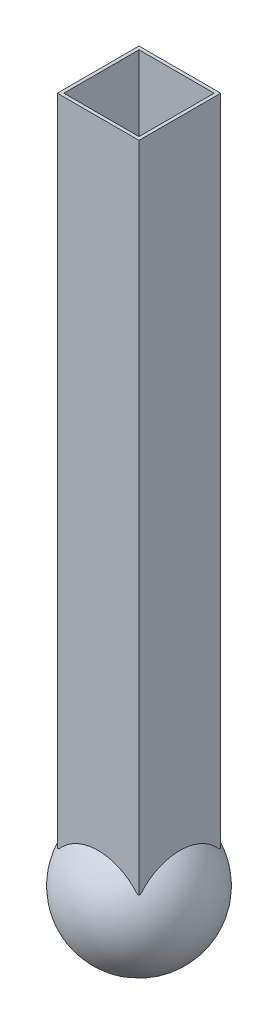
ISO-10303-21;
HEADER;
FILE_DESCRIPTION(('STEP AP214'),'2;1');
FILE_NAME('part.step','',(''),(''),'','','');
FILE_SCHEMA(('AUTOMOTIVE_DESIGN { 1 0 10303 214 1 1 1 1 }'));
ENDSEC;
DATA;
#1=APPLICATION_CONTEXT('core data for automotive mechanical design processes');
#2=APPLICATION_PROTOCOL_DEFINITION('international standard','automotive_design',2000,#1);
#3=PRODUCT_CONTEXT('',#1,'mechanical');
#4=PRODUCT('Part','Part','',(#3));
#5=PRODUCT_RELATED_PRODUCT_CATEGORY('part','',(#4));
#6=PRODUCT_DEFINITION_FORMATION('','',#4);
#7=PRODUCT_DEFINITION_CONTEXT('part definition',#1,'design');
#8=PRODUCT_DEFINITION('design','',#6,#7);
#9=PRODUCT_DEFINITION_SHAPE('','',#8);
#10=(LENGTH_UNIT() NAMED_UNIT(*) SI_UNIT(.MILLI.,.METRE.));
#11=(NAMED_UNIT(*) PLANE_ANGLE_UNIT() SI_UNIT($,.RADIAN.));
#12=(NAMED_UNIT(*) SI_UNIT($,.STERADIAN.) SOLID_ANGLE_UNIT());
#13=UNCERTAINTY_MEASURE_WITH_UNIT(LENGTH_MEASURE(1.E-05),#10,'distance_accuracy_value','');
#14=(GEOMETRIC_REPRESENTATION_CONTEXT(3) GLOBAL_UNCERTAINTY_ASSIGNED_CONTEXT((#13)) GLOBAL_UNIT_ASSIGNED_CONTEXT((#10,
#11,#12)) REPRESENTATION_CONTEXT('',''));
#15=CARTESIAN_POINT('',(0.,0.,0.));
#16=DIRECTION('',(0.,0.,1.));
#17=DIRECTION('',(1.,0.,0.));
#18=AXIS2_PLACEMENT_3D('',#15,#16,#17);
#19=CARTESIAN_POINT('',(0.,0.,0.));
#20=DIRECTION('',(0.,1.,0.));
#21=DIRECTION('',(0.,0.,1.));
#22=AXIS2_PLACEMENT_3D('',#19,#20,#21);
#23=PLANE('',#22);
#24=CARTESIAN_POINT('',(0.,0.,0.));
#25=DIRECTION('',(0.,1.,0.));
#26=DIRECTION('',(0.,0.,1.));
#27=AXIS2_PLACEMENT_3D('',#24,#25,#26);
#28=CIRCLE('',#27,17.3205080756888);
#29=CARTESIAN_POINT('',(-11.9895788082818,0.,12.5));
#30=VERTEX_POINT('',#29);
#31=CARTESIAN_POINT('',(-12.5,0.,11.9895788082818));
#32=VERTEX_POINT('',#31);
#33=EDGE_CURVE('E274',#30,#32,#28,.F.);
#34=ORIENTED_EDGE('',*,*,#33,.F.);
#35=DIRECTION('',(1.,0.,0.));
#36=VECTOR('',#35,1.);
#37=CARTESIAN_POINT('',(-12.5,0.,12.5));
#38=LINE('',#37,#36);
#39=CARTESIAN_POINT('',(-12.5,0.,12.5));
#40=VERTEX_POINT('',#39);
#41=EDGE_CURVE('E213',#40,#30,#38,.T.);
#42=ORIENTED_EDGE('',*,*,#41,.F.);
#43=DIRECTION('',(0.,0.,1.));
#44=VECTOR('',#43,1.);
#45=CARTESIAN_POINT('',(-12.5,0.,-12.5));
#46=LINE('',#45,#44);
#47=EDGE_CURVE('E222',#32,#40,#46,.T.);
#48=ORIENTED_EDGE('',*,*,#47,.F.);
#49=EDGE_LOOP('',(#34,#42,#48));
#50=FACE_BOUND('',#49,.T.);
#51=ADVANCED_FACE('F37',(#50),#23,.F.);
#52=CARTESIAN_POINT('',(-12.5,0.,-11.9895788082818));
#53=VERTEX_POINT('',#52);
#54=CARTESIAN_POINT('',(-11.9895788082818,0.,-12.5));
#55=VERTEX_POINT('',#54);
#56=EDGE_CURVE('E268',#53,#55,#28,.F.);
#57=ORIENTED_EDGE('',*,*,#56,.F.);
#58=CARTESIAN_POINT('',(-12.5,0.,-12.5));
#59=VERTEX_POINT('',#58);
#60=EDGE_CURVE('E218',#59,#53,#46,.T.);
#61=ORIENTED_EDGE('',*,*,#60,.F.);
#62=DIRECTION('',(-1.,0.,0.));
#63=VECTOR('',#62,1.);
#64=CARTESIAN_POINT('',(-12.5,0.,-12.5));
#65=LINE('',#64,#63);
#66=EDGE_CURVE('E226',#55,#59,#65,.T.);
#67=ORIENTED_EDGE('',*,*,#66,.F.);
#68=EDGE_LOOP('',(#57,#61,#67));
#69=FACE_BOUND('',#68,.T.);
#70=ADVANCED_FACE('F384',(#69),#23,.F.);
#71=CARTESIAN_POINT('',(11.9895788082818,0.,-12.5));
#72=VERTEX_POINT('',#71);
#73=CARTESIAN_POINT('',(12.5,0.,-11.9895788082818));
#74=VERTEX_POINT('',#73);
#75=EDGE_CURVE('E270',#72,#74,#28,.F.);
#76=ORIENTED_EDGE('',*,*,#75,.F.);
#77=CARTESIAN_POINT('',(12.5,0.,-12.5));
#78=VERTEX_POINT('',#77);
#79=EDGE_CURVE('E223',#78,#72,#65,.T.);
#80=ORIENTED_EDGE('',*,*,#79,.F.);
#81=DIRECTION('',(0.,0.,-1.));
#82=VECTOR('',#81,1.);
#83=CARTESIAN_POINT('',(12.5,0.,-12.5));
#84=LINE('',#83,#82);
#85=EDGE_CURVE('E230',#74,#78,#84,.T.);
#86=ORIENTED_EDGE('',*,*,#85,.F.);
#87=EDGE_LOOP('',(#76,#80,#86));
#88=FACE_BOUND('',#87,.T.);
#89=ADVANCED_FACE('F389',(#88),#23,.F.);
#90=CARTESIAN_POINT('',(0.,200.,0.));
#91=DIRECTION('',(0.,1.,0.));
#92=DIRECTION('',(0.,0.,1.));
#93=AXIS2_PLACEMENT_3D('',#90,#91,#92);
#94=PLANE('',#93);
#95=DIRECTION('',(0.,0.,-1.));
#96=VECTOR('',#95,1.);
#97=CARTESIAN_POINT('',(12.5,200.,-12.5));
#98=LINE('',#97,#96);
#99=CARTESIAN_POINT('',(12.5,200.,12.5));
#100=VERTEX_POINT('',#99);
#101=CARTESIAN_POINT('',(12.5,200.,-12.5));
#102=VERTEX_POINT('',#101);
#103=EDGE_CURVE('E215',#100,#102,#98,.T.);
#104=ORIENTED_EDGE('',*,*,#103,.T.);
#105=DIRECTION('',(-1.,0.,0.));
#106=VECTOR('',#105,1.);
#107=CARTESIAN_POINT('',(-12.5,200.,-12.5));
#108=LINE('',#107,#106);
#109=CARTESIAN_POINT('',(-12.5,200.,-12.5));
#110=VERTEX_POINT('',#109);
#111=EDGE_CURVE('E234',#102,#110,#108,.T.);
#112=ORIENTED_EDGE('',*,*,#111,.T.);
#113=DIRECTION('',(0.,0.,1.));
#114=VECTOR('',#113,1.);
#115=CARTESIAN_POINT('',(-12.5,200.,-12.5));
#116=LINE('',#115,#114);
#117=CARTESIAN_POINT('',(-12.5,200.,12.5));
#118=VERTEX_POINT('',#117);
#119=EDGE_CURVE('E232',#110,#118,#116,.T.);
#120=ORIENTED_EDGE('',*,*,#119,.T.);
#121=DIRECTION('',(1.,0.,0.));
#122=VECTOR('',#121,1.);
#123=CARTESIAN_POINT('',(-12.5,200.,12.5));
#124=LINE('',#123,#122);
#125=EDGE_CURVE('E212',#118,#100,#124,.T.);
#126=ORIENTED_EDGE('',*,*,#125,.T.);
#127=EDGE_LOOP('',(#104,#112,#120,#126));
#128=FACE_BOUND('',#127,.T.);
#129=DIRECTION('',(1.,0.,0.));
#130=VECTOR('',#129,1.);
#131=CARTESIAN_POINT('',(-11.5,200.,11.5));
#132=LINE('',#131,#130);
#133=CARTESIAN_POINT('',(-11.5,200.,11.5));
#134=VERTEX_POINT('',#133);
#135=CARTESIAN_POINT('',(11.5,200.,11.5));
#136=VERTEX_POINT('',#135);
#137=EDGE_CURVE('E263',#134,#136,#132,.T.);
#138=ORIENTED_EDGE('',*,*,#137,.F.);
#139=DIRECTION('',(0.,0.,1.));
#140=VECTOR('',#139,1.);
#141=CARTESIAN_POINT('',(-11.5,200.,-11.5));
#142=LINE('',#141,#140);
#143=CARTESIAN_POINT('',(-11.5,200.,-11.5));
#144=VERTEX_POINT('',#143);
#145=EDGE_CURVE('E183',#144,#134,#142,.T.);
#146=ORIENTED_EDGE('',*,*,#145,.F.);
#147=DIRECTION('',(-1.,0.,0.));
#148=VECTOR('',#147,1.);
#149=CARTESIAN_POINT('',(-11.5,200.,-11.5));
#150=LINE('',#149,#148);
#151=CARTESIAN_POINT('',(11.5,200.,-11.5));
#152=VERTEX_POINT('',#151);
#153=EDGE_CURVE('E249',#152,#144,#150,.T.);
#154=ORIENTED_EDGE('',*,*,#153,.F.);
#155=DIRECTION('',(0.,0.,-1.));
#156=VECTOR('',#155,1.);
#157=CARTESIAN_POINT('',(11.5,200.,-11.5));
#158=LINE('',#157,#156);
#159=EDGE_CURVE('E260',#136,#152,#158,.T.);
#160=ORIENTED_EDGE('',*,*,#159,.F.);
#161=EDGE_LOOP('',(#138,#146,#154,#160));
#162=FACE_BOUND('',#161,.T.);
#163=ADVANCED_FACE('F489',(#128,#162),#94,.T.);
#164=CARTESIAN_POINT('',(12.5,0.,11.9895788082818));
#165=VERTEX_POINT('',#164);
#166=CARTESIAN_POINT('',(11.9895788082818,0.,12.5));
#167=VERTEX_POINT('',#166);
#168=EDGE_CURVE('E275',#165,#167,#28,.F.);
#169=ORIENTED_EDGE('',*,*,#168,.F.);
#170=CARTESIAN_POINT('',(12.5,0.,12.5));
#171=VERTEX_POINT('',#170);
#172=EDGE_CURVE('E227',#171,#165,#84,.T.);
#173=ORIENTED_EDGE('',*,*,#172,.F.);
#174=EDGE_CURVE('E217',#167,#171,#38,.T.);
#175=ORIENTED_EDGE('',*,*,#174,.F.);
#176=EDGE_LOOP('',(#169,#173,#175));
#177=FACE_BOUND('',#176,.T.);
#178=ADVANCED_FACE('F392',(#177),#23,.F.);
#179=CARTESIAN_POINT('',(12.5,200.,-12.5));
#180=DIRECTION('',(-1.,0.,0.));
#181=DIRECTION('',(0.,0.,1.));
#182=AXIS2_PLACEMENT_3D('',#179,#180,#181);
#183=PLANE('',#182);
#184=CARTESIAN_POINT('',(12.5,-10.,0.));
#185=DIRECTION('',(-1.,0.,0.));
#186=DIRECTION('',(0.,0.,1.));
#187=AXIS2_PLACEMENT_3D('',#184,#185,#186);
#188=CIRCLE('',#187,15.612494995996);
#189=EDGE_CURVE('E53',#74,#165,#188,.F.);
#190=ORIENTED_EDGE('',*,*,#189,.F.);
#191=ORIENTED_EDGE('',*,*,#85,.T.);
#192=DIRECTION('',(0.,-1.,0.));
#193=VECTOR('',#192,1.);
#194=CARTESIAN_POINT('',(12.5,200.,-12.5));
#195=LINE('',#194,#193);
#196=EDGE_CURVE('E199',#102,#78,#195,.T.);
#197=ORIENTED_EDGE('',*,*,#196,.F.);
#198=ORIENTED_EDGE('',*,*,#103,.F.);
#199=DIRECTION('',(0.,-1.,0.));
#200=VECTOR('',#199,1.);
#201=CARTESIAN_POINT('',(12.5,200.,12.5));
#202=LINE('',#201,#200);
#203=EDGE_CURVE('E209',#100,#171,#202,.T.);
#204=ORIENTED_EDGE('',*,*,#203,.T.);
#205=ORIENTED_EDGE('',*,*,#172,.T.);
#206=EDGE_LOOP('',(#190,#191,#197,#198,#204,#205));
#207=FACE_BOUND('',#206,.T.);
#208=ADVANCED_FACE('F39',(#207),#183,.F.);
#209=CARTESIAN_POINT('',(-12.5,200.,-12.5));
#210=DIRECTION('',(0.,0.,1.));
#211=DIRECTION('',(1.,0.,0.));
#212=AXIS2_PLACEMENT_3D('',#209,#210,#211);
#213=PLANE('',#212);
#214=CARTESIAN_POINT('',(0.,-10.,-12.5));
#215=DIRECTION('',(0.,0.,1.));
#216=DIRECTION('',(1.,0.,0.));
#217=AXIS2_PLACEMENT_3D('',#214,#215,#216);
#218=CIRCLE('',#217,15.612494995996);
#219=EDGE_CURVE('E258',#55,#72,#218,.F.);
#220=ORIENTED_EDGE('',*,*,#219,.F.);
#221=ORIENTED_EDGE('',*,*,#66,.T.);
#222=DIRECTION('',(0.,-1.,0.));
#223=VECTOR('',#222,1.);
#224=CARTESIAN_POINT('',(-12.5,200.,-12.5));
#225=LINE('',#224,#223);
#226=EDGE_CURVE('E201',#110,#59,#225,.T.);
#227=ORIENTED_EDGE('',*,*,#226,.F.);
#228=ORIENTED_EDGE('',*,*,#111,.F.);
#229=ORIENTED_EDGE('',*,*,#196,.T.);
#230=ORIENTED_EDGE('',*,*,#79,.T.);
#231=EDGE_LOOP('',(#220,#221,#227,#228,#229,#230));
#232=FACE_BOUND('',#231,.T.);
#233=ADVANCED_FACE('F358',(#232),#213,.F.);
#234=CARTESIAN_POINT('',(-12.5,200.,-12.5));
#235=DIRECTION('',(1.,0.,0.));
#236=DIRECTION('',(0.,0.,-1.));
#237=AXIS2_PLACEMENT_3D('',#234,#235,#236);
#238=PLANE('',#237);
#239=CARTESIAN_POINT('',(-12.5,-10.,0.));
#240=DIRECTION('',(1.,0.,0.));
#241=DIRECTION('',(0.,0.,-1.));
#242=AXIS2_PLACEMENT_3D('',#239,#240,#241);
#243=CIRCLE('',#242,15.612494995996);
#244=EDGE_CURVE('E271',#32,#53,#243,.F.);
#245=ORIENTED_EDGE('',*,*,#244,.F.);
#246=ORIENTED_EDGE('',*,*,#47,.T.);
#247=DIRECTION('',(0.,-1.,0.));
#248=VECTOR('',#247,1.);
#249=CARTESIAN_POINT('',(-12.5,200.,12.5));
#250=LINE('',#249,#248);
#251=EDGE_CURVE('E206',#118,#40,#250,.T.);
#252=ORIENTED_EDGE('',*,*,#251,.F.);
#253=ORIENTED_EDGE('',*,*,#119,.F.);
#254=ORIENTED_EDGE('',*,*,#226,.T.);
#255=ORIENTED_EDGE('',*,*,#60,.T.);
#256=EDGE_LOOP('',(#245,#246,#252,#253,#254,#255));
#257=FACE_BOUND('',#256,.T.);
#258=ADVANCED_FACE('F343',(#257),#238,.F.);
#259=CARTESIAN_POINT('',(-12.5,200.,12.5));
#260=DIRECTION('',(0.,0.,-1.));
#261=DIRECTION('',(-1.,0.,0.));
#262=AXIS2_PLACEMENT_3D('',#259,#260,#261);
#263=PLANE('',#262);
#264=CARTESIAN_POINT('',(0.,-10.,12.5));
#265=DIRECTION('',(0.,0.,-1.));
#266=DIRECTION('',(-1.,0.,0.));
#267=AXIS2_PLACEMENT_3D('',#264,#265,#266);
#268=CIRCLE('',#267,15.612494995996);
#269=EDGE_CURVE('E278',#167,#30,#268,.F.);
#270=ORIENTED_EDGE('',*,*,#269,.F.);
#271=ORIENTED_EDGE('',*,*,#174,.T.);
#272=ORIENTED_EDGE('',*,*,#203,.F.);
#273=ORIENTED_EDGE('',*,*,#125,.F.);
#274=ORIENTED_EDGE('',*,*,#251,.T.);
#275=ORIENTED_EDGE('',*,*,#41,.T.);
#276=EDGE_LOOP('',(#270,#271,#272,#273,#274,#275));
#277=FACE_BOUND('',#276,.T.);
#278=ADVANCED_FACE('F348',(#277),#263,.F.);
#279=CARTESIAN_POINT('',(-11.5,200.,-11.5));
#280=DIRECTION('',(1.,0.,0.));
#281=DIRECTION('',(0.,0.,-1.));
#282=AXIS2_PLACEMENT_3D('',#279,#280,#281);
#283=PLANE('',#282);
#284=DIRECTION('',(0.,-1.,0.));
#285=VECTOR('',#284,1.);
#286=CARTESIAN_POINT('',(-11.5,200.,11.5));
#287=LINE('',#286,#285);
#288=CARTESIAN_POINT('',(-11.5,1.64044672682282,11.5));
#289=VERTEX_POINT('',#288);
#290=EDGE_CURVE('E238',#134,#289,#287,.T.);
#291=ORIENTED_EDGE('',*,*,#290,.T.);
#292=CARTESIAN_POINT('',(-11.5,-10.,0.));
#293=DIRECTION('',(1.,0.,0.));
#294=DIRECTION('',(0.,0.,-1.));
#295=AXIS2_PLACEMENT_3D('',#292,#293,#294);
#296=CIRCLE('',#295,16.3630681719536);
#297=CARTESIAN_POINT('',(-11.5,1.64044672682282,-11.5));
#298=VERTEX_POINT('',#297);
#299=EDGE_CURVE('E281',#289,#298,#296,.F.);
#300=ORIENTED_EDGE('',*,*,#299,.T.);
#301=DIRECTION('',(0.,-1.,0.));
#302=VECTOR('',#301,1.);
#303=CARTESIAN_POINT('',(-11.5,200.,-11.5));
#304=LINE('',#303,#302);
#305=EDGE_CURVE('E247',#144,#298,#304,.T.);
#306=ORIENTED_EDGE('',*,*,#305,.F.);
#307=ORIENTED_EDGE('',*,*,#145,.T.);
#308=EDGE_LOOP('',(#291,#300,#306,#307));
#309=FACE_BOUND('',#308,.T.);
#310=ADVANCED_FACE('F334',(#309),#283,.T.);
#311=CARTESIAN_POINT('',(-11.5,200.,11.5));
#312=DIRECTION('',(0.,0.,-1.));
#313=DIRECTION('',(-1.,0.,0.));
#314=AXIS2_PLACEMENT_3D('',#311,#312,#313);
#315=PLANE('',#314);
#316=DIRECTION('',(0.,-1.,0.));
#317=VECTOR('',#316,1.);
#318=CARTESIAN_POINT('',(11.5,200.,11.5));
#319=LINE('',#318,#317);
#320=CARTESIAN_POINT('',(11.5,1.6404467268228,11.5));
#321=VERTEX_POINT('',#320);
#322=EDGE_CURVE('E241',#136,#321,#319,.T.);
#323=ORIENTED_EDGE('',*,*,#322,.T.);
#324=CARTESIAN_POINT('',(0.,-10.,11.5));
#325=DIRECTION('',(0.,0.,-1.));
#326=DIRECTION('',(-1.,0.,0.));
#327=AXIS2_PLACEMENT_3D('',#324,#325,#326);
#328=CIRCLE('',#327,16.3630681719536);
#329=EDGE_CURVE('E284',#321,#289,#328,.F.);
#330=ORIENTED_EDGE('',*,*,#329,.T.);
#331=ORIENTED_EDGE('',*,*,#290,.F.);
#332=ORIENTED_EDGE('',*,*,#137,.T.);
#333=EDGE_LOOP('',(#323,#330,#331,#332));
#334=FACE_BOUND('',#333,.T.);
#335=ADVANCED_FACE('F347',(#334),#315,.T.);
#336=CARTESIAN_POINT('',(11.5,200.,-11.5));
#337=DIRECTION('',(-1.,0.,0.));
#338=DIRECTION('',(0.,0.,1.));
#339=AXIS2_PLACEMENT_3D('',#336,#337,#338);
#340=PLANE('',#339);
#341=DIRECTION('',(0.,-1.,0.));
#342=VECTOR('',#341,1.);
#343=CARTESIAN_POINT('',(11.5,200.,-11.5));
#344=LINE('',#343,#342);
#345=CARTESIAN_POINT('',(11.5,1.64044672682282,-11.5));
#346=VERTEX_POINT('',#345);
#347=EDGE_CURVE('E244',#152,#346,#344,.T.);
#348=ORIENTED_EDGE('',*,*,#347,.T.);
#349=CARTESIAN_POINT('',(11.5,-10.,0.));
#350=DIRECTION('',(-1.,0.,0.));
#351=DIRECTION('',(0.,0.,1.));
#352=AXIS2_PLACEMENT_3D('',#349,#350,#351);
#353=CIRCLE('',#352,16.3630681719536);
#354=EDGE_CURVE('E287',#346,#321,#353,.F.);
#355=ORIENTED_EDGE('',*,*,#354,.T.);
#356=ORIENTED_EDGE('',*,*,#322,.F.);
#357=ORIENTED_EDGE('',*,*,#159,.T.);
#358=EDGE_LOOP('',(#348,#355,#356,#357));
#359=FACE_BOUND('',#358,.T.);
#360=ADVANCED_FACE('F369',(#359),#340,.T.);
#361=CARTESIAN_POINT('',(-11.5,200.,-11.5));
#362=DIRECTION('',(0.,0.,1.));
#363=DIRECTION('',(1.,0.,0.));
#364=AXIS2_PLACEMENT_3D('',#361,#362,#363);
#365=PLANE('',#364);
#366=ORIENTED_EDGE('',*,*,#305,.T.);
#367=CARTESIAN_POINT('',(0.,-10.,-11.5));
#368=DIRECTION('',(0.,0.,1.));
#369=DIRECTION('',(1.,0.,0.));
#370=AXIS2_PLACEMENT_3D('',#367,#368,#369);
#371=CIRCLE('',#370,16.3630681719536);
#372=EDGE_CURVE('E11',#298,#346,#371,.F.);
#373=ORIENTED_EDGE('',*,*,#372,.T.);
#374=ORIENTED_EDGE('',*,*,#347,.F.);
#375=ORIENTED_EDGE('',*,*,#153,.T.);
#376=EDGE_LOOP('',(#366,#373,#374,#375));
#377=FACE_BOUND('',#376,.T.);
#378=ADVANCED_FACE('F365',(#377),#365,.T.);
#379=CARTESIAN_POINT('',(0.,-10.,0.));
#380=DIRECTION('',(0.,0.,-1.));
#381=DIRECTION('',(-1.,0.,0.));
#382=AXIS2_PLACEMENT_3D('',#379,#380,#381);
#383=SPHERICAL_SURFACE('',#382,20.);
#384=ORIENTED_EDGE('',*,*,#299,.F.);
#385=ORIENTED_EDGE('',*,*,#329,.F.);
#386=ORIENTED_EDGE('',*,*,#354,.F.);
#387=ORIENTED_EDGE('',*,*,#372,.F.);
#388=EDGE_LOOP('',(#384,#385,#386,#387));
#389=FACE_BOUND('',#388,.T.);
#390=ADVANCED_FACE('F361',(#389),#383,.T.);
#391=ORIENTED_EDGE('',*,*,#56,.T.);
#392=ORIENTED_EDGE('',*,*,#219,.T.);
#393=ORIENTED_EDGE('',*,*,#75,.T.);
#394=ORIENTED_EDGE('',*,*,#189,.T.);
#395=ORIENTED_EDGE('',*,*,#168,.T.);
#396=ORIENTED_EDGE('',*,*,#269,.T.);
#397=ORIENTED_EDGE('',*,*,#33,.T.);
#398=ORIENTED_EDGE('',*,*,#244,.T.);
#399=EDGE_LOOP('',(#391,#392,#393,#394,#395,#396,#397,#398));
#400=FACE_BOUND('',#399,.T.);
#401=ADVANCED_FACE('F364',(#400),#383,.T.);
#402=CLOSED_SHELL('',(#51,#70,#89,#163,#178,#208,#233,#258,#278,#310,#335,#360,#378,#390,#401));
#403=CARTESIAN_POINT('',(0.,-10.,0.));
#404=DIRECTION('',(0.,0.,-1.));
#405=DIRECTION('',(1.,0.,0.));
#406=AXIS2_PLACEMENT_3D('',#403,#404,#405);
#407=SPHERICAL_SURFACE('',#406,19.);
#408=CARTESIAN_POINT('',(0.,-10.,12.5));
#409=DIRECTION('',(0.,0.,-1.));
#410=DIRECTION('',(-1.,0.,0.));
#411=AXIS2_PLACEMENT_3D('',#408,#409,#410);
#412=CIRCLE('',#411,14.3090880212542);
#413=CARTESIAN_POINT('',(10.2347447452294,0.,12.5));
#414=VERTEX_POINT('',#413);
#415=CARTESIAN_POINT('',(-10.2347447452294,0.,12.5));
#416=VERTEX_POINT('',#415);
#417=EDGE_CURVE('E296',#414,#416,#412,.F.);
#418=ORIENTED_EDGE('',*,*,#417,.F.);
#419=CARTESIAN_POINT('',(0.,0.,0.));
#420=DIRECTION('',(0.,1.,0.));
#421=DIRECTION('',(0.,0.,1.));
#422=AXIS2_PLACEMENT_3D('',#419,#420,#421);
#423=CIRCLE('',#422,16.1554944214035);
#424=CARTESIAN_POINT('',(11.3468057179102,0.,11.5));
#425=VERTEX_POINT('',#424);
#426=EDGE_CURVE('E302',#425,#414,#423,.F.);
#427=ORIENTED_EDGE('',*,*,#426,.F.);
#428=CARTESIAN_POINT('',(0.,-10.,11.5));
#429=DIRECTION('',(0.,0.,-1.));
#430=DIRECTION('',(-1.,0.,0.));
#431=AXIS2_PLACEMENT_3D('',#428,#429,#430);
#432=CIRCLE('',#431,15.1244834622542);
#433=CARTESIAN_POINT('',(-11.3468057179102,0.,11.5));
#434=VERTEX_POINT('',#433);
#435=EDGE_CURVE('E299',#425,#434,#432,.F.);
#436=ORIENTED_EDGE('',*,*,#435,.T.);
#437=EDGE_CURVE('E298',#416,#434,#423,.F.);
#438=ORIENTED_EDGE('',*,*,#437,.F.);
#439=EDGE_LOOP('',(#418,#427,#436,#438));
#440=FACE_BOUND('',#439,.T.);
#441=CARTESIAN_POINT('',(0.,-10.,-12.5));
#442=DIRECTION('',(0.,0.,1.));
#443=DIRECTION('',(1.,0.,0.));
#444=AXIS2_PLACEMENT_3D('',#441,#442,#443);
#445=CIRCLE('',#444,14.3090880212542);
#446=CARTESIAN_POINT('',(-10.2347447452294,0.,-12.5));
#447=VERTEX_POINT('',#446);
#448=CARTESIAN_POINT('',(10.2347447452294,0.,-12.5));
#449=VERTEX_POINT('',#448);
#450=EDGE_CURVE('E309',#447,#449,#445,.F.);
#451=ORIENTED_EDGE('',*,*,#450,.F.);
#452=CARTESIAN_POINT('',(-11.3468057179102,0.,-11.5));
#453=VERTEX_POINT('',#452);
#454=EDGE_CURVE('E194',#453,#447,#423,.F.);
#455=ORIENTED_EDGE('',*,*,#454,.F.);
#456=CARTESIAN_POINT('',(0.,-10.,-11.5));
#457=DIRECTION('',(0.,0.,1.));
#458=DIRECTION('',(1.,0.,0.));
#459=AXIS2_PLACEMENT_3D('',#456,#457,#458);
#460=CIRCLE('',#459,15.1244834622542);
#461=CARTESIAN_POINT('',(11.3468057179102,0.,-11.5));
#462=VERTEX_POINT('',#461);
#463=EDGE_CURVE('E46',#453,#462,#460,.F.);
#464=ORIENTED_EDGE('',*,*,#463,.T.);
#465=EDGE_CURVE('E188',#449,#462,#423,.F.);
#466=ORIENTED_EDGE('',*,*,#465,.F.);
#467=EDGE_LOOP('',(#451,#455,#464,#466));
#468=FACE_BOUND('',#467,.T.);
#469=CARTESIAN_POINT('',(12.5,-10.,0.));
#470=DIRECTION('',(-1.,0.,0.));
#471=DIRECTION('',(0.,0.,1.));
#472=AXIS2_PLACEMENT_3D('',#469,#470,#471);
#473=CIRCLE('',#472,14.3090880212542);
#474=CARTESIAN_POINT('',(12.5,0.,-10.2347447452294));
#475=VERTEX_POINT('',#474);
#476=CARTESIAN_POINT('',(12.5,0.,10.2347447452294));
#477=VERTEX_POINT('',#476);
#478=EDGE_CURVE('E303',#475,#477,#473,.F.);
#479=ORIENTED_EDGE('',*,*,#478,.F.);
#480=CARTESIAN_POINT('',(11.5,0.,-11.3468057179102));
#481=VERTEX_POINT('',#480);
#482=EDGE_CURVE('E61',#481,#475,#423,.F.);
#483=ORIENTED_EDGE('',*,*,#482,.F.);
#484=CARTESIAN_POINT('',(11.5,-10.,0.));
#485=DIRECTION('',(-1.,0.,0.));
#486=DIRECTION('',(0.,0.,1.));
#487=AXIS2_PLACEMENT_3D('',#484,#485,#486);
#488=CIRCLE('',#487,15.1244834622542);
#489=CARTESIAN_POINT('',(11.5,0.,11.3468057179102));
#490=VERTEX_POINT('',#489);
#491=EDGE_CURVE('E305',#481,#490,#488,.F.);
#492=ORIENTED_EDGE('',*,*,#491,.T.);
#493=EDGE_CURVE('E308',#477,#490,#423,.F.);
#494=ORIENTED_EDGE('',*,*,#493,.F.);
#495=EDGE_LOOP('',(#479,#483,#492,#494));
#496=FACE_BOUND('',#495,.T.);
#497=CARTESIAN_POINT('',(-12.5,-10.,0.));
#498=DIRECTION('',(1.,0.,0.));
#499=DIRECTION('',(0.,0.,-1.));
#500=AXIS2_PLACEMENT_3D('',#497,#498,#499);
#501=CIRCLE('',#500,14.3090880212542);
#502=CARTESIAN_POINT('',(-12.5,0.,10.2347447452294));
#503=VERTEX_POINT('',#502);
#504=CARTESIAN_POINT('',(-12.5,0.,-10.2347447452294));
#505=VERTEX_POINT('',#504);
#506=EDGE_CURVE('E290',#503,#505,#501,.F.);
#507=ORIENTED_EDGE('',*,*,#506,.F.);
#508=CARTESIAN_POINT('',(-11.5,0.,11.3468057179102));
#509=VERTEX_POINT('',#508);
#510=EDGE_CURVE('E196',#509,#503,#423,.F.);
#511=ORIENTED_EDGE('',*,*,#510,.F.);
#512=CARTESIAN_POINT('',(-11.5,-10.,0.));
#513=DIRECTION('',(1.,0.,0.));
#514=DIRECTION('',(0.,0.,-1.));
#515=AXIS2_PLACEMENT_3D('',#512,#513,#514);
#516=CIRCLE('',#515,15.1244834622542);
#517=CARTESIAN_POINT('',(-11.5,0.,-11.3468057179102));
#518=VERTEX_POINT('',#517);
#519=EDGE_CURVE('E292',#509,#518,#516,.F.);
#520=ORIENTED_EDGE('',*,*,#519,.T.);
#521=EDGE_CURVE('E295',#505,#518,#423,.F.);
#522=ORIENTED_EDGE('',*,*,#521,.F.);
#523=EDGE_LOOP('',(#507,#511,#520,#522));
#524=FACE_BOUND('',#523,.T.);
#525=ADVANCED_FACE('F197',(#440,#468,#496,#524),#407,.F.);
#526=EDGE_CURVE('E191',#449,#447,#65,.T.);
#527=ORIENTED_EDGE('',*,*,#526,.T.);
#528=ORIENTED_EDGE('',*,*,#450,.T.);
#529=EDGE_LOOP('',(#527,#528));
#530=FACE_BOUND('',#529,.T.);
#531=ADVANCED_FACE('F351',(#530),#213,.F.);
#532=ORIENTED_EDGE('',*,*,#463,.F.);
#533=DIRECTION('',(-1.,0.,0.));
#534=VECTOR('',#533,1.);
#535=CARTESIAN_POINT('',(-11.5,0.,-11.5));
#536=LINE('',#535,#534);
#537=EDGE_CURVE('E177',#462,#453,#536,.T.);
#538=ORIENTED_EDGE('',*,*,#537,.F.);
#539=EDGE_LOOP('',(#532,#538));
#540=FACE_BOUND('',#539,.T.);
#541=ADVANCED_FACE('F179',(#540),#365,.T.);
#542=ORIENTED_EDGE('',*,*,#537,.T.);
#543=ORIENTED_EDGE('',*,*,#454,.T.);
#544=ORIENTED_EDGE('',*,*,#526,.F.);
#545=ORIENTED_EDGE('',*,*,#465,.T.);
#546=EDGE_LOOP('',(#542,#543,#544,#545));
#547=FACE_BOUND('',#546,.T.);
#548=ADVANCED_FACE('F189',(#547),#23,.F.);
#549=EDGE_CURVE('E229',#477,#475,#84,.T.);
#550=ORIENTED_EDGE('',*,*,#549,.T.);
#551=ORIENTED_EDGE('',*,*,#478,.T.);
#552=EDGE_LOOP('',(#550,#551));
#553=FACE_BOUND('',#552,.T.);
#554=ADVANCED_FACE('F395',(#553),#183,.F.);
#555=ORIENTED_EDGE('',*,*,#491,.F.);
#556=DIRECTION('',(0.,0.,-1.));
#557=VECTOR('',#556,1.);
#558=CARTESIAN_POINT('',(11.5,0.,-11.5));
#559=LINE('',#558,#557);
#560=EDGE_CURVE('E184',#490,#481,#559,.T.);
#561=ORIENTED_EDGE('',*,*,#560,.F.);
#562=EDGE_LOOP('',(#555,#561));
#563=FACE_BOUND('',#562,.T.);
#564=ADVANCED_FACE('F373',(#563),#340,.T.);
#565=ORIENTED_EDGE('',*,*,#560,.T.);
#566=ORIENTED_EDGE('',*,*,#482,.T.);
#567=ORIENTED_EDGE('',*,*,#549,.F.);
#568=ORIENTED_EDGE('',*,*,#493,.T.);
#569=EDGE_LOOP('',(#565,#566,#567,#568));
#570=FACE_BOUND('',#569,.T.);
#571=ADVANCED_FACE('F381',(#570),#23,.F.);
#572=ORIENTED_EDGE('',*,*,#435,.F.);
#573=DIRECTION('',(1.,0.,0.));
#574=VECTOR('',#573,1.);
#575=CARTESIAN_POINT('',(-11.5,0.,11.5));
#576=LINE('',#575,#574);
#577=EDGE_CURVE('E252',#434,#425,#576,.T.);
#578=ORIENTED_EDGE('',*,*,#577,.F.);
#579=EDGE_LOOP('',(#572,#578));
#580=FACE_BOUND('',#579,.T.);
#581=ADVANCED_FACE('F376',(#580),#315,.T.);
#582=EDGE_CURVE('E216',#416,#414,#38,.T.);
#583=ORIENTED_EDGE('',*,*,#582,.T.);
#584=ORIENTED_EDGE('',*,*,#417,.T.);
#585=EDGE_LOOP('',(#583,#584));
#586=FACE_BOUND('',#585,.T.);
#587=ADVANCED_FACE('F380',(#586),#263,.F.);
#588=ORIENTED_EDGE('',*,*,#582,.F.);
#589=ORIENTED_EDGE('',*,*,#437,.T.);
#590=ORIENTED_EDGE('',*,*,#577,.T.);
#591=ORIENTED_EDGE('',*,*,#426,.T.);
#592=EDGE_LOOP('',(#588,#589,#590,#591));
#593=FACE_BOUND('',#592,.T.);
#594=ADVANCED_FACE('F341',(#593),#23,.F.);
#595=EDGE_CURVE('E221',#505,#503,#46,.T.);
#596=ORIENTED_EDGE('',*,*,#595,.T.);
#597=ORIENTED_EDGE('',*,*,#506,.T.);
#598=EDGE_LOOP('',(#596,#597));
#599=FACE_BOUND('',#598,.T.);
#600=ADVANCED_FACE('F329',(#599),#238,.F.);
#601=ORIENTED_EDGE('',*,*,#519,.F.);
#602=DIRECTION('',(0.,0.,1.));
#603=VECTOR('',#602,1.);
#604=CARTESIAN_POINT('',(-11.5,0.,-11.5));
#605=LINE('',#604,#603);
#606=EDGE_CURVE('E255',#518,#509,#605,.T.);
#607=ORIENTED_EDGE('',*,*,#606,.F.);
#608=EDGE_LOOP('',(#601,#607));
#609=FACE_BOUND('',#608,.T.);
#610=ADVANCED_FACE('F331',(#609),#283,.T.);
#611=ORIENTED_EDGE('',*,*,#606,.T.);
#612=ORIENTED_EDGE('',*,*,#510,.T.);
#613=ORIENTED_EDGE('',*,*,#595,.F.);
#614=ORIENTED_EDGE('',*,*,#521,.T.);
#615=EDGE_LOOP('',(#611,#612,#613,#614));
#616=FACE_BOUND('',#615,.T.);
#617=ADVANCED_FACE('F325',(#616),#23,.F.);
#618=CLOSED_SHELL('',(#525,#531,#541,#548,#554,#564,#571,#581,#587,#594,#600,#610,#617));
#619=ORIENTED_CLOSED_SHELL('',*,#618,.T.);
#620=BREP_WITH_VOIDS('B2',#402,(#619));
#621=ADVANCED_BREP_SHAPE_REPRESENTATION('',(#18,#620),#14);
#622=SHAPE_DEFINITION_REPRESENTATION(#9,#621);
ENDSEC;
END-ISO-10303-21;
